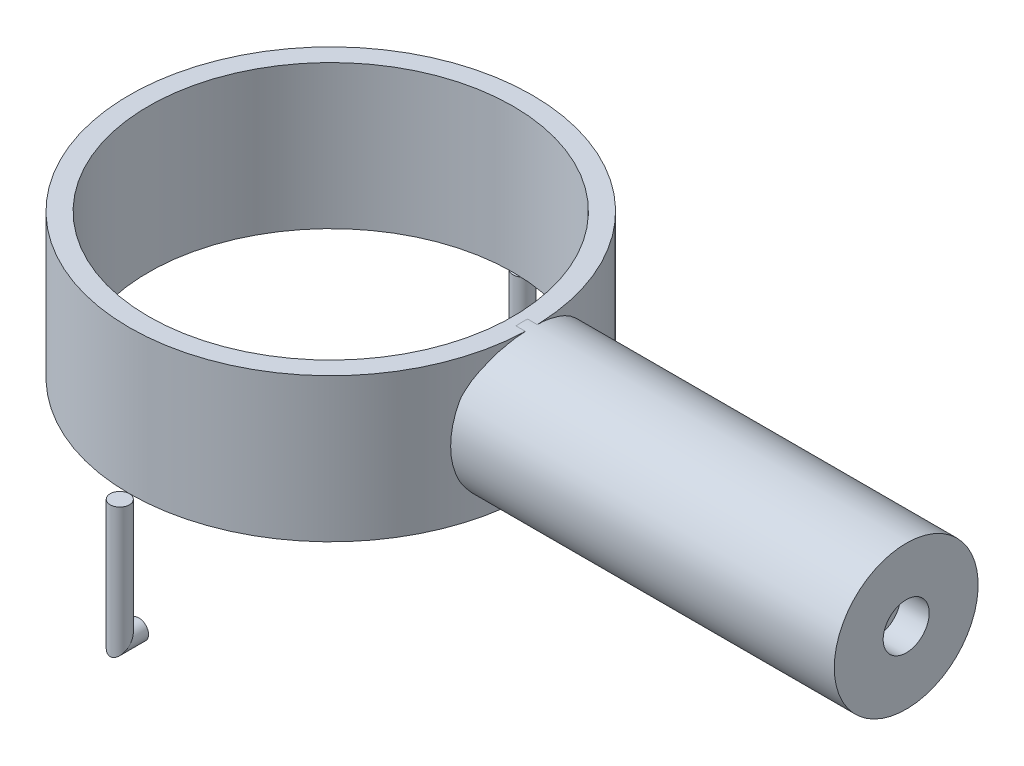
ISO-10303-21;
HEADER;
FILE_DESCRIPTION(('STEP AP214'),'2;1');
FILE_NAME('part.step','',(''),(''),'','','');
FILE_SCHEMA(('AUTOMOTIVE_DESIGN { 1 0 10303 214 1 1 1 1 }'));
ENDSEC;
DATA;
#1=APPLICATION_CONTEXT('core data for automotive mechanical design processes');
#2=APPLICATION_PROTOCOL_DEFINITION('international standard','automotive_design',2000,#1);
#3=PRODUCT_CONTEXT('',#1,'mechanical');
#4=PRODUCT('Part','Part','',(#3));
#5=PRODUCT_RELATED_PRODUCT_CATEGORY('part','',(#4));
#6=PRODUCT_DEFINITION_FORMATION('','',#4);
#7=PRODUCT_DEFINITION_CONTEXT('part definition',#1,'design');
#8=PRODUCT_DEFINITION('design','',#6,#7);
#9=PRODUCT_DEFINITION_SHAPE('','',#8);
#10=(LENGTH_UNIT() NAMED_UNIT(*) SI_UNIT(.MILLI.,.METRE.));
#11=(NAMED_UNIT(*) PLANE_ANGLE_UNIT() SI_UNIT($,.RADIAN.));
#12=(NAMED_UNIT(*) SI_UNIT($,.STERADIAN.) SOLID_ANGLE_UNIT());
#13=UNCERTAINTY_MEASURE_WITH_UNIT(LENGTH_MEASURE(1.E-05),#10,'distance_accuracy_value','');
#14=(GEOMETRIC_REPRESENTATION_CONTEXT(3) GLOBAL_UNCERTAINTY_ASSIGNED_CONTEXT((#13)) GLOBAL_UNIT_ASSIGNED_CONTEXT((#10,
#11,#12)) REPRESENTATION_CONTEXT('',''));
#15=CARTESIAN_POINT('',(0.,0.,0.));
#16=DIRECTION('',(0.,0.,1.));
#17=DIRECTION('',(1.,0.,0.));
#18=AXIS2_PLACEMENT_3D('',#15,#16,#17);
#19=CARTESIAN_POINT('',(0.,-12.9513435572596,-18.));
#20=DIRECTION('',(0.,0.,-1.));
#21=DIRECTION('',(-1.,0.,0.));
#22=AXIS2_PLACEMENT_3D('',#19,#20,#21);
#23=PLANE('',#22);
#24=CARTESIAN_POINT('',(0.,-12.9513435572596,-18.));
#25=DIRECTION('',(0.,0.,-1.));
#26=DIRECTION('',(-1.,0.,0.));
#27=AXIS2_PLACEMENT_3D('',#24,#25,#26);
#28=CIRCLE('',#27,1.);
#29=CARTESIAN_POINT('',(-1.,-12.9513435572596,-18.));
#30=VERTEX_POINT('',#29);
#31=EDGE_CURVE('E90',#30,#30,#28,.T.);
#32=ORIENTED_EDGE('',*,*,#31,.F.);
#33=EDGE_LOOP('',(#32));
#34=FACE_BOUND('',#33,.T.);
#35=ADVANCED_FACE('F87',(#34),#23,.F.);
#36=CARTESIAN_POINT('',(0.,-0.234854142357042,-20.));
#37=DIRECTION('',(0.,1.,0.));
#38=DIRECTION('',(-1.,0.,0.));
#39=AXIS2_PLACEMENT_3D('',#36,#37,#38);
#40=PLANE('',#39);
#41=CARTESIAN_POINT('',(0.,-0.234854142357042,-20.));
#42=DIRECTION('',(0.,1.,0.));
#43=DIRECTION('',(-1.,0.,0.));
#44=AXIS2_PLACEMENT_3D('',#41,#42,#43);
#45=CIRCLE('',#44,1.);
#46=CARTESIAN_POINT('',(-1.,-0.234854142357042,-20.));
#47=VERTEX_POINT('',#46);
#48=EDGE_CURVE('E94',#47,#47,#45,.T.);
#49=ORIENTED_EDGE('',*,*,#48,.T.);
#50=EDGE_LOOP('',(#49));
#51=FACE_BOUND('',#50,.T.);
#52=ADVANCED_FACE('F107',(#51),#40,.T.);
#53=CARTESIAN_POINT('',(0.,-12.9513435572596,-22.3));
#54=DIRECTION('',(0.,0.,1.));
#55=DIRECTION('',(0.,-1.,0.));
#56=AXIS2_PLACEMENT_3D('',#53,#54,#55);
#57=CYLINDRICAL_SURFACE('',#56,1.);
#58=CARTESIAN_POINT('',(0.,-12.9513435572596,-20.));
#59=DIRECTION('',(0.,-0.707106781186547,0.707106781186548));
#60=DIRECTION('',(0.,-0.707106781186548,-0.707106781186547));
#61=AXIS2_PLACEMENT_3D('',#58,#59,#60);
#62=ELLIPSE('',#61,1.4142135623731,1.);
#63=CARTESIAN_POINT('',(0.,-13.9513435572596,-21.));
#64=VERTEX_POINT('',#63);
#65=EDGE_CURVE('E14',#64,#64,#62,.T.);
#66=ORIENTED_EDGE('',*,*,#65,.T.);
#67=EDGE_LOOP('',(#66));
#68=FACE_BOUND('',#67,.T.);
#69=ORIENTED_EDGE('',*,*,#31,.T.);
#70=EDGE_LOOP('',(#69));
#71=FACE_BOUND('',#70,.T.);
#72=ADVANCED_FACE('F104',(#68,#71),#57,.T.);
#73=CARTESIAN_POINT('',(0.,-0.234854142357042,-20.));
#74=DIRECTION('',(0.,-1.,0.));
#75=DIRECTION('',(0.,0.,-1.));
#76=AXIS2_PLACEMENT_3D('',#73,#74,#75);
#77=CYLINDRICAL_SURFACE('',#76,1.);
#78=ORIENTED_EDGE('',*,*,#48,.F.);
#79=EDGE_LOOP('',(#78));
#80=FACE_BOUND('',#79,.T.);
#81=ORIENTED_EDGE('',*,*,#65,.F.);
#82=EDGE_LOOP('',(#81));
#83=FACE_BOUND('',#82,.T.);
#84=ADVANCED_FACE('F111',(#80,#83),#77,.T.);
#85=CLOSED_SHELL('',(#35,#52,#72,#84));
#86=MANIFOLD_SOLID_BREP('B2',#85);
#87=CARTESIAN_POINT('',(0.,-12.7164894149025,20.));
#88=DIRECTION('',(0.,0.,1.));
#89=DIRECTION('',(1.,0.,0.));
#90=AXIS2_PLACEMENT_3D('',#87,#88,#89);
#91=PLANE('',#90);
#92=CARTESIAN_POINT('',(0.,-12.7164894149025,20.));
#93=DIRECTION('',(0.,0.,1.));
#94=DIRECTION('',(1.,0.,0.));
#95=AXIS2_PLACEMENT_3D('',#92,#93,#94);
#96=CIRCLE('',#95,1.);
#97=CARTESIAN_POINT('',(1.,-12.7164894149025,20.));
#98=VERTEX_POINT('',#97);
#99=EDGE_CURVE('E169',#98,#98,#96,.T.);
#100=ORIENTED_EDGE('',*,*,#99,.F.);
#101=EDGE_LOOP('',(#100));
#102=FACE_BOUND('',#101,.T.);
#103=ADVANCED_FACE('F166',(#102),#91,.F.);
#104=CARTESIAN_POINT('',(0.,0.,22.));
#105=DIRECTION('',(0.,1.,0.));
#106=DIRECTION('',(1.,0.,0.));
#107=AXIS2_PLACEMENT_3D('',#104,#105,#106);
#108=PLANE('',#107);
#109=CARTESIAN_POINT('',(0.,0.,22.));
#110=DIRECTION('',(0.,1.,0.));
#111=DIRECTION('',(1.,0.,0.));
#112=AXIS2_PLACEMENT_3D('',#109,#110,#111);
#113=CIRCLE('',#112,1.);
#114=CARTESIAN_POINT('',(1.,0.,22.));
#115=VERTEX_POINT('',#114);
#116=EDGE_CURVE('E173',#115,#115,#113,.T.);
#117=ORIENTED_EDGE('',*,*,#116,.T.);
#118=EDGE_LOOP('',(#117));
#119=FACE_BOUND('',#118,.T.);
#120=ADVANCED_FACE('F186',(#119),#108,.T.);
#121=CARTESIAN_POINT('',(0.,-12.7164894149025,24.3));
#122=DIRECTION('',(0.,0.,-1.));
#123=DIRECTION('',(-1.,0.,0.));
#124=AXIS2_PLACEMENT_3D('',#121,#122,#123);
#125=CYLINDRICAL_SURFACE('',#124,1.);
#126=CARTESIAN_POINT('',(0.,-12.7164894149025,22.));
#127=DIRECTION('',(0.,-0.707106781186548,-0.707106781186548));
#128=DIRECTION('',(0.,-0.707106781186548,0.707106781186548));
#129=AXIS2_PLACEMENT_3D('',#126,#127,#128);
#130=ELLIPSE('',#129,1.41421356237309,1.);
#131=CARTESIAN_POINT('',(0.,-13.7164894149025,23.));
#132=VERTEX_POINT('',#131);
#133=EDGE_CURVE('E86',#132,#132,#130,.T.);
#134=ORIENTED_EDGE('',*,*,#133,.T.);
#135=EDGE_LOOP('',(#134));
#136=FACE_BOUND('',#135,.T.);
#137=ORIENTED_EDGE('',*,*,#99,.T.);
#138=EDGE_LOOP('',(#137));
#139=FACE_BOUND('',#138,.T.);
#140=ADVANCED_FACE('F183',(#136,#139),#125,.T.);
#141=CARTESIAN_POINT('',(0.,0.,22.));
#142=DIRECTION('',(0.,-1.,0.));
#143=DIRECTION('',(0.,0.,-1.));
#144=AXIS2_PLACEMENT_3D('',#141,#142,#143);
#145=CYLINDRICAL_SURFACE('',#144,1.);
#146=ORIENTED_EDGE('',*,*,#116,.F.);
#147=EDGE_LOOP('',(#146));
#148=FACE_BOUND('',#147,.T.);
#149=ORIENTED_EDGE('',*,*,#133,.F.);
#150=EDGE_LOOP('',(#149));
#151=FACE_BOUND('',#150,.T.);
#152=ADVANCED_FACE('F190',(#148,#151),#145,.T.);
#153=CLOSED_SHELL('',(#103,#120,#140,#152));
#154=MANIFOLD_SOLID_BREP('B9',#153);
#155=CARTESIAN_POINT('',(60.,7.53200533422256,0.));
#156=DIRECTION('',(-1.,0.,0.));
#157=DIRECTION('',(0.,0.,1.));
#158=AXIS2_PLACEMENT_3D('',#155,#156,#157);
#159=CYLINDRICAL_SURFACE('',#158,7.5);
#160=CARTESIAN_POINT('',(60.,7.53200533422256,0.));
#161=DIRECTION('',(1.,0.,0.));
#162=DIRECTION('',(0.,0.,-1.));
#163=AXIS2_PLACEMENT_3D('',#160,#161,#162);
#164=CIRCLE('',#163,7.5);
#165=CARTESIAN_POINT('',(60.,7.53200533422256,7.5));
#166=VERTEX_POINT('',#165);
#167=EDGE_CURVE('E165',#166,#166,#164,.T.);
#168=CARTESIAN_POINT('',(20.,7.53200533422256,0.));
#169=DIRECTION('',(1.,0.,0.));
#170=DIRECTION('',(0.,0.,-1.));
#171=AXIS2_PLACEMENT_3D('',#168,#169,#170);
#172=CIRCLE('',#171,7.5);
#173=CARTESIAN_POINT('',(20.,7.53200533422256,7.5));
#174=VERTEX_POINT('',#173);
#175=EDGE_CURVE('E249',#174,#174,#172,.T.);
#176=CARTESIAN_POINT('',(60.,7.53200533422256,7.5));
#177=CARTESIAN_POINT('',(59.5833333333333,7.53200533422256,7.5));
#178=CARTESIAN_POINT('',(59.1666666666667,7.53200533422256,7.5));
#179=CARTESIAN_POINT('',(58.3333333333333,7.53200533422256,7.5));
#180=CARTESIAN_POINT('',(57.9166666666667,7.53200533422256,7.5));
#181=CARTESIAN_POINT('',(57.0833333333333,7.53200533422256,7.5));
#182=CARTESIAN_POINT('',(56.6666666666667,7.53200533422256,7.5));
#183=CARTESIAN_POINT('',(55.8333333333333,7.53200533422256,7.5));
#184=CARTESIAN_POINT('',(55.4166666666667,7.53200533422256,7.5));
#185=CARTESIAN_POINT('',(54.5833333333333,7.53200533422256,7.5));
#186=CARTESIAN_POINT('',(54.1666666666667,7.53200533422256,7.5));
#187=CARTESIAN_POINT('',(53.3333333333333,7.53200533422256,7.5));
#188=CARTESIAN_POINT('',(52.9166666666667,7.53200533422256,7.5));
#189=CARTESIAN_POINT('',(52.0833333333333,7.53200533422256,7.5));
#190=CARTESIAN_POINT('',(51.6666666666667,7.53200533422256,7.5));
#191=CARTESIAN_POINT('',(50.8333333333333,7.53200533422256,7.5));
#192=CARTESIAN_POINT('',(50.4166666666667,7.53200533422256,7.5));
#193=CARTESIAN_POINT('',(49.5833333333333,7.53200533422256,7.5));
#194=CARTESIAN_POINT('',(49.1666666666667,7.53200533422256,7.5));
#195=CARTESIAN_POINT('',(48.3333333333333,7.53200533422256,7.5));
#196=CARTESIAN_POINT('',(47.9166666666667,7.53200533422256,7.5));
#197=CARTESIAN_POINT('',(47.0833333333333,7.53200533422256,7.5));
#198=CARTESIAN_POINT('',(46.6666666666667,7.53200533422256,7.5));
#199=CARTESIAN_POINT('',(45.8333333333333,7.53200533422256,7.5));
#200=CARTESIAN_POINT('',(45.4166666666667,7.53200533422256,7.5));
#201=CARTESIAN_POINT('',(44.5833333333333,7.53200533422256,7.5));
#202=CARTESIAN_POINT('',(44.1666666666667,7.53200533422256,7.5));
#203=CARTESIAN_POINT('',(43.3333333333333,7.53200533422256,7.5));
#204=CARTESIAN_POINT('',(42.9166666666667,7.53200533422256,7.5));
#205=CARTESIAN_POINT('',(42.0833333333333,7.53200533422256,7.5));
#206=CARTESIAN_POINT('',(41.6666666666667,7.53200533422256,7.5));
#207=CARTESIAN_POINT('',(40.8333333333333,7.53200533422256,7.5));
#208=CARTESIAN_POINT('',(40.4166666666667,7.53200533422256,7.5));
#209=CARTESIAN_POINT('',(39.5833333333333,7.53200533422256,7.5));
#210=CARTESIAN_POINT('',(39.1666666666667,7.53200533422256,7.5));
#211=CARTESIAN_POINT('',(38.3333333333333,7.53200533422256,7.5));
#212=CARTESIAN_POINT('',(37.9166666666667,7.53200533422256,7.5));
#213=CARTESIAN_POINT('',(37.0833333333333,7.53200533422256,7.5));
#214=CARTESIAN_POINT('',(36.6666666666667,7.53200533422256,7.5));
#215=CARTESIAN_POINT('',(35.8333333333333,7.53200533422256,7.5));
#216=CARTESIAN_POINT('',(35.4166666666667,7.53200533422256,7.5));
#217=CARTESIAN_POINT('',(34.5833333333333,7.53200533422256,7.5));
#218=CARTESIAN_POINT('',(34.1666666666667,7.53200533422256,7.5));
#219=CARTESIAN_POINT('',(33.3333333333333,7.53200533422256,7.5));
#220=CARTESIAN_POINT('',(32.9166666666667,7.53200533422256,7.5));
#221=CARTESIAN_POINT('',(32.0833333333333,7.53200533422256,7.5));
#222=CARTESIAN_POINT('',(31.6666666666667,7.53200533422256,7.5));
#223=CARTESIAN_POINT('',(30.8333333333333,7.53200533422256,7.5));
#224=CARTESIAN_POINT('',(30.4166666666667,7.53200533422256,7.5));
#225=CARTESIAN_POINT('',(29.5833333333333,7.53200533422256,7.5));
#226=CARTESIAN_POINT('',(29.1666666666667,7.53200533422256,7.5));
#227=CARTESIAN_POINT('',(28.3333333333333,7.53200533422256,7.5));
#228=CARTESIAN_POINT('',(27.9166666666667,7.53200533422256,7.5));
#229=CARTESIAN_POINT('',(27.0833333333333,7.53200533422256,7.5));
#230=CARTESIAN_POINT('',(26.6666666666667,7.53200533422256,7.5));
#231=CARTESIAN_POINT('',(25.8333333333333,7.53200533422256,7.5));
#232=CARTESIAN_POINT('',(25.4166666666667,7.53200533422256,7.5));
#233=CARTESIAN_POINT('',(24.5833333333333,7.53200533422256,7.5));
#234=CARTESIAN_POINT('',(24.1666666666667,7.53200533422256,7.5));
#235=CARTESIAN_POINT('',(23.3333333333333,7.53200533422256,7.5));
#236=CARTESIAN_POINT('',(22.9166666666667,7.53200533422256,7.5));
#237=CARTESIAN_POINT('',(22.0833333333333,7.53200533422256,7.5));
#238=CARTESIAN_POINT('',(21.6666666666667,7.53200533422256,7.5));
#239=CARTESIAN_POINT('',(20.8333333333333,7.53200533422256,7.5));
#240=CARTESIAN_POINT('',(20.4166666666667,7.53200533422256,7.5));
#241=CARTESIAN_POINT('',(20.,7.53200533422256,7.5));
#242=B_SPLINE_CURVE_WITH_KNOTS('',3,(#176,#177,#178,#179,#180,#181,#182,#183,#184,#185,#186,
#187,#188,#189,#190,#191,#192,#193,#194,#195,#196,#197,#198,#199,#200,#201,#202,#203,#204,#205,
#206,#207,#208,#209,#210,#211,#212,#213,#214,#215,#216,#217,#218,#219,#220,#221,#222,#223,#224,
#225,#226,#227,#228,#229,#230,#231,#232,#233,#234,#235,#236,#237,#238,#239,#240,#241),
.UNSPECIFIED.,.F.,.F.,(4,2,2,2,2,2,2,2,2,2,2,2,2,2,2,2,2,2,2,2,2,2,2,2,2,2,2,2,2,2,2,2,4),(0.,
1.25,2.5,3.75,5.,6.25000000000001,7.50000000000001,8.75000000000001,10.,11.25,12.5,13.75,15.,
16.25,17.5,18.75,20.,21.25,22.5,23.75,25.,26.25,27.5,28.75,30.,31.25,32.5,33.75,35.,36.25,37.5,
38.75,40.),.UNSPECIFIED.);
#243=EDGE_CURVE('BSEAM246',#166,#174,#242,.T.);
#244=ORIENTED_EDGE('',*,*,#167,.F.);
#245=ORIENTED_EDGE('',*,*,#175,.T.);
#246=ORIENTED_EDGE('',*,*,#243,.T.);
#247=ORIENTED_EDGE('',*,*,#243,.F.);
#248=EDGE_LOOP('',(#244,#246,#245,#247));
#249=FACE_BOUND('',#248,.T.);
#250=ADVANCED_FACE('F246',(#249),#159,.T.);
#251=CARTESIAN_POINT('',(60.,7.53200533422256,0.));
#252=DIRECTION('',(1.,0.,0.));
#253=DIRECTION('',(0.,0.,-1.));
#254=AXIS2_PLACEMENT_3D('',#251,#252,#253);
#255=PLANE('',#254);
#256=CARTESIAN_POINT('',(60.,7.53200533422256,0.));
#257=DIRECTION('',(1.,0.,0.));
#258=DIRECTION('',(0.,0.,-1.));
#259=AXIS2_PLACEMENT_3D('',#256,#257,#258);
#260=CIRCLE('',#259,2.4);
#261=CARTESIAN_POINT('',(60.,7.53200533422256,-2.4));
#262=VERTEX_POINT('',#261);
#263=EDGE_CURVE('E260',#262,#262,#260,.T.);
#264=ORIENTED_EDGE('',*,*,#263,.F.);
#265=EDGE_LOOP('',(#264));
#266=FACE_BOUND('',#265,.T.);
#267=ORIENTED_EDGE('',*,*,#167,.T.);
#268=EDGE_LOOP('',(#267));
#269=FACE_BOUND('',#268,.T.);
#270=ADVANCED_FACE('F277',(#266,#269),#255,.T.);
#271=CARTESIAN_POINT('',(20.,7.53200533422256,0.));
#272=DIRECTION('',(1.,0.,0.));
#273=DIRECTION('',(0.,0.,-1.));
#274=AXIS2_PLACEMENT_3D('',#271,#272,#273);
#275=PLANE('',#274);
#276=ORIENTED_EDGE('',*,*,#175,.F.);
#277=EDGE_LOOP('',(#276));
#278=FACE_BOUND('',#277,.T.);
#279=ADVANCED_FACE('F273',(#278),#275,.F.);
#280=CARTESIAN_POINT('',(57.,7.53200533422256,0.));
#281=DIRECTION('',(1.,0.,0.));
#282=DIRECTION('',(0.,0.,-1.));
#283=AXIS2_PLACEMENT_3D('',#280,#281,#282);
#284=CYLINDRICAL_SURFACE('',#283,2.4);
#285=CARTESIAN_POINT('',(57.,7.53200533422256,0.));
#286=DIRECTION('',(1.,0.,0.));
#287=DIRECTION('',(0.,0.,-1.));
#288=AXIS2_PLACEMENT_3D('',#285,#286,#287);
#289=CIRCLE('',#288,2.4);
#290=CARTESIAN_POINT('',(57.,7.53200533422256,-2.4));
#291=VERTEX_POINT('',#290);
#292=EDGE_CURVE('E258',#291,#291,#289,.T.);
#293=ORIENTED_EDGE('',*,*,#292,.F.);
#294=EDGE_LOOP('',(#293));
#295=FACE_BOUND('',#294,.T.);
#296=ORIENTED_EDGE('',*,*,#263,.T.);
#297=EDGE_LOOP('',(#296));
#298=FACE_BOUND('',#297,.T.);
#299=ADVANCED_FACE('F270',(#295,#298),#284,.F.);
#300=CARTESIAN_POINT('',(57.,7.53200533422256,0.));
#301=DIRECTION('',(1.,0.,0.));
#302=DIRECTION('',(0.,0.,-1.));
#303=AXIS2_PLACEMENT_3D('',#300,#301,#302);
#304=PLANE('',#303);
#305=ORIENTED_EDGE('',*,*,#292,.T.);
#306=EDGE_LOOP('',(#305));
#307=FACE_BOUND('',#306,.T.);
#308=ADVANCED_FACE('F268',(#307),#304,.T.);
#309=CLOSED_SHELL('',(#250,#270,#279,#299,#308));
#310=MANIFOLD_SOLID_BREP('B81',#309);
#311=CARTESIAN_POINT('',(0.,15.,0.));
#312=DIRECTION('',(0.,1.,0.));
#313=DIRECTION('',(0.,0.,1.));
#314=AXIS2_PLACEMENT_3D('',#311,#312,#313);
#315=PLANE('',#314);
#316=CARTESIAN_POINT('',(0.,15.,0.));
#317=DIRECTION('',(0.,1.,0.));
#318=DIRECTION('',(0.,0.,1.));
#319=AXIS2_PLACEMENT_3D('',#316,#317,#318);
#320=CIRCLE('',#319,21.);
#321=CARTESIAN_POINT('',(0.,15.,21.));
#322=VERTEX_POINT('',#321);
#323=EDGE_CURVE('E244',#322,#322,#320,.T.);
#324=ORIENTED_EDGE('',*,*,#323,.T.);
#325=EDGE_LOOP('',(#324));
#326=FACE_BOUND('',#325,.T.);
#327=CARTESIAN_POINT('',(0.,15.,0.));
#328=DIRECTION('',(0.,1.,0.));
#329=DIRECTION('',(0.,0.,1.));
#330=AXIS2_PLACEMENT_3D('',#327,#328,#329);
#331=CIRCLE('',#330,19.);
#332=CARTESIAN_POINT('',(0.,15.,19.));
#333=VERTEX_POINT('',#332);
#334=EDGE_CURVE('E348',#333,#333,#331,.T.);
#335=ORIENTED_EDGE('',*,*,#334,.F.);
#336=EDGE_LOOP('',(#335));
#337=FACE_BOUND('',#336,.T.);
#338=ADVANCED_FACE('F336',(#326,#337),#315,.T.);
#339=CARTESIAN_POINT('',(0.,0.,0.));
#340=DIRECTION('',(0.,1.,0.));
#341=DIRECTION('',(0.,0.,1.));
#342=AXIS2_PLACEMENT_3D('',#339,#340,#341);
#343=PLANE('',#342);
#344=CARTESIAN_POINT('',(0.,0.,0.));
#345=DIRECTION('',(0.,1.,0.));
#346=DIRECTION('',(0.,0.,1.));
#347=AXIS2_PLACEMENT_3D('',#344,#345,#346);
#348=CIRCLE('',#347,21.);
#349=CARTESIAN_POINT('',(0.,0.,21.));
#350=VERTEX_POINT('',#349);
#351=EDGE_CURVE('E340',#350,#350,#348,.T.);
#352=ORIENTED_EDGE('',*,*,#351,.F.);
#353=EDGE_LOOP('',(#352));
#354=FACE_BOUND('',#353,.T.);
#355=CARTESIAN_POINT('',(0.,0.,0.));
#356=DIRECTION('',(0.,1.,0.));
#357=DIRECTION('',(0.,0.,1.));
#358=AXIS2_PLACEMENT_3D('',#355,#356,#357);
#359=CIRCLE('',#358,19.);
#360=CARTESIAN_POINT('',(0.,0.,19.));
#361=VERTEX_POINT('',#360);
#362=EDGE_CURVE('E350',#361,#361,#359,.T.);
#363=ORIENTED_EDGE('',*,*,#362,.T.);
#364=EDGE_LOOP('',(#363));
#365=FACE_BOUND('',#364,.T.);
#366=ADVANCED_FACE('F358',(#354,#365),#343,.F.);
#367=CARTESIAN_POINT('',(0.,15.,0.));
#368=DIRECTION('',(0.,-1.,0.));
#369=DIRECTION('',(0.,0.,-1.));
#370=AXIS2_PLACEMENT_3D('',#367,#368,#369);
#371=CYLINDRICAL_SURFACE('',#370,21.);
#372=ORIENTED_EDGE('',*,*,#323,.F.);
#373=EDGE_LOOP('',(#372));
#374=FACE_BOUND('',#373,.T.);
#375=ORIENTED_EDGE('',*,*,#351,.T.);
#376=EDGE_LOOP('',(#375));
#377=FACE_BOUND('',#376,.T.);
#378=ADVANCED_FACE('F338',(#374,#377),#371,.T.);
#379=CARTESIAN_POINT('',(0.,15.,0.));
#380=DIRECTION('',(0.,-1.,0.));
#381=DIRECTION('',(0.,0.,-1.));
#382=AXIS2_PLACEMENT_3D('',#379,#380,#381);
#383=CYLINDRICAL_SURFACE('',#382,19.);
#384=ORIENTED_EDGE('',*,*,#334,.T.);
#385=EDGE_LOOP('',(#384));
#386=FACE_BOUND('',#385,.T.);
#387=ORIENTED_EDGE('',*,*,#362,.F.);
#388=EDGE_LOOP('',(#387));
#389=FACE_BOUND('',#388,.T.);
#390=ADVANCED_FACE('F360',(#386,#389),#383,.F.);
#391=CLOSED_SHELL('',(#338,#366,#378,#390));
#392=MANIFOLD_SOLID_BREP('B160',#391);
#393=ADVANCED_BREP_SHAPE_REPRESENTATION('',(#18,#86,#154,#310,#392),#14);
#394=SHAPE_DEFINITION_REPRESENTATION(#9,#393);
ENDSEC;
END-ISO-10303-21;
